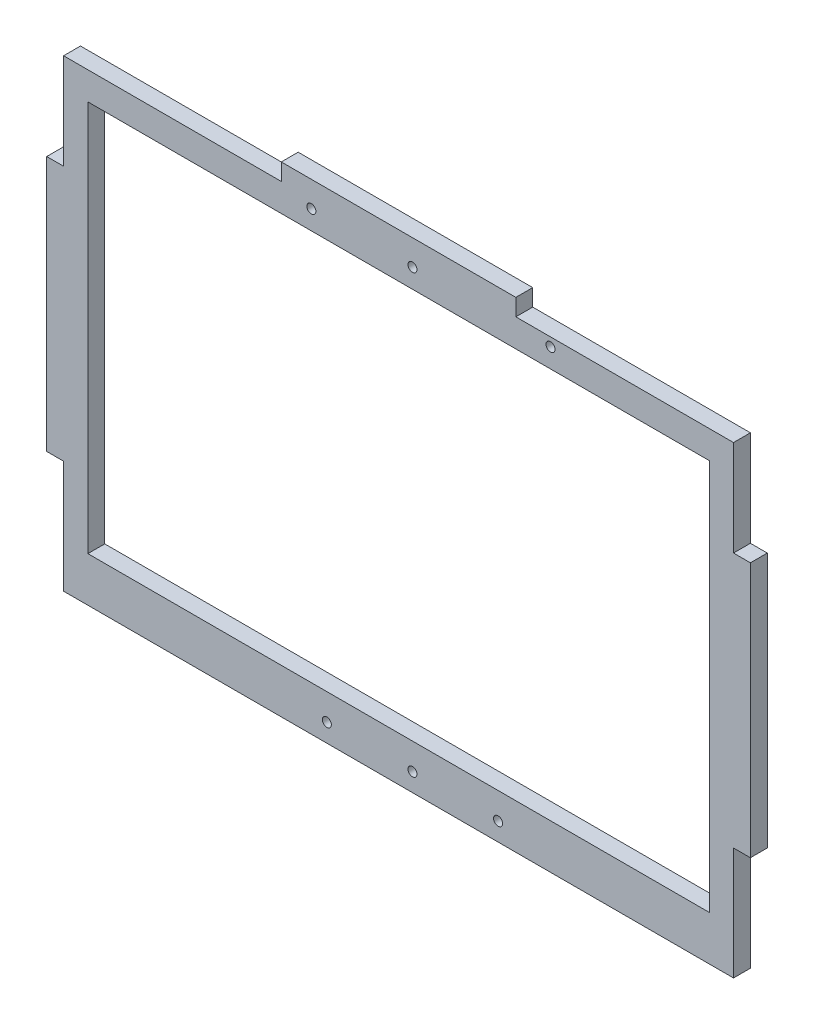
ISO-10303-21;
HEADER;
FILE_DESCRIPTION(('STEP AP214'),'2;1');
FILE_NAME('part.step','',(''),(''),'','','');
FILE_SCHEMA(('AUTOMOTIVE_DESIGN { 1 0 10303 214 1 1 1 1 }'));
ENDSEC;
DATA;
#1=APPLICATION_CONTEXT('core data for automotive mechanical design processes');
#2=APPLICATION_PROTOCOL_DEFINITION('international standard','automotive_design',2000,#1);
#3=PRODUCT_CONTEXT('',#1,'mechanical');
#4=PRODUCT('Part','Part','',(#3));
#5=PRODUCT_RELATED_PRODUCT_CATEGORY('part','',(#4));
#6=PRODUCT_DEFINITION_FORMATION('','',#4);
#7=PRODUCT_DEFINITION_CONTEXT('part definition',#1,'design');
#8=PRODUCT_DEFINITION('design','',#6,#7);
#9=PRODUCT_DEFINITION_SHAPE('','',#8);
#10=(LENGTH_UNIT() NAMED_UNIT(*) SI_UNIT(.MILLI.,.METRE.));
#11=(NAMED_UNIT(*) PLANE_ANGLE_UNIT() SI_UNIT($,.RADIAN.));
#12=(NAMED_UNIT(*) SI_UNIT($,.STERADIAN.) SOLID_ANGLE_UNIT());
#13=UNCERTAINTY_MEASURE_WITH_UNIT(LENGTH_MEASURE(1.E-05),#10,'distance_accuracy_value','');
#14=(GEOMETRIC_REPRESENTATION_CONTEXT(3) GLOBAL_UNCERTAINTY_ASSIGNED_CONTEXT((#13)) GLOBAL_UNIT_ASSIGNED_CONTEXT((#10,
#11,#12)) REPRESENTATION_CONTEXT('',''));
#15=CARTESIAN_POINT('',(0.,0.,0.));
#16=DIRECTION('',(0.,0.,1.));
#17=DIRECTION('',(1.,0.,0.));
#18=AXIS2_PLACEMENT_3D('',#15,#16,#17);
#19=CARTESIAN_POINT('',(125.,77.8166592675793,3.));
#20=DIRECTION('',(0.,0.,-1.));
#21=DIRECTION('',(-1.,0.,0.));
#22=AXIS2_PLACEMENT_3D('',#19,#20,#21);
#23=PLANE('',#22);
#24=DIRECTION('',(0.,-1.,0.));
#25=VECTOR('',#24,1.);
#26=CARTESIAN_POINT('',(139.62,93.6916592675793,3.));
#27=LINE('',#26,#25);
#28=CARTESIAN_POINT('',(139.62,232.691659267579,3.));
#29=VERTEX_POINT('',#28);
#30=CARTESIAN_POINT('',(139.62,93.6916592675793,3.));
#31=VERTEX_POINT('',#30);
#32=EDGE_CURVE('E220',#29,#31,#27,.T.);
#33=ORIENTED_EDGE('',*,*,#32,.T.);
#34=DIRECTION('',(1.,0.,0.));
#35=VECTOR('',#34,1.);
#36=CARTESIAN_POINT('',(139.62,93.6916592675793,3.));
#37=LINE('',#36,#35);
#38=CARTESIAN_POINT('',(360.38,93.6916592675793,3.));
#39=VERTEX_POINT('',#38);
#40=EDGE_CURVE('E223',#31,#39,#37,.T.);
#41=ORIENTED_EDGE('',*,*,#40,.T.);
#42=DIRECTION('',(0.,1.,0.));
#43=VECTOR('',#42,1.);
#44=CARTESIAN_POINT('',(360.38,93.6916592675793,3.));
#45=LINE('',#44,#43);
#46=CARTESIAN_POINT('',(360.38,232.691659267579,3.));
#47=VERTEX_POINT('',#46);
#48=EDGE_CURVE('E227',#39,#47,#45,.T.);
#49=ORIENTED_EDGE('',*,*,#48,.T.);
#50=DIRECTION('',(-1.,0.,0.));
#51=VECTOR('',#50,1.);
#52=CARTESIAN_POINT('',(139.62,232.691659267579,3.));
#53=LINE('',#52,#51);
#54=EDGE_CURVE('E230',#47,#29,#53,.T.);
#55=ORIENTED_EDGE('',*,*,#54,.T.);
#56=EDGE_LOOP('',(#33,#41,#49,#55));
#57=FACE_BOUND('',#56,.T.);
#58=DIRECTION('',(0.,1.,0.));
#59=VECTOR('',#58,1.);
#60=CARTESIAN_POINT('',(208.333333333333,248.566659267579,3.));
#61=LINE('',#60,#59);
#62=CARTESIAN_POINT('',(208.333333333333,242.566659267579,3.));
#63=VERTEX_POINT('',#62);
#64=CARTESIAN_POINT('',(208.333333333333,248.566659267579,3.));
#65=VERTEX_POINT('',#64);
#66=EDGE_CURVE('E182',#63,#65,#61,.T.);
#67=ORIENTED_EDGE('',*,*,#66,.T.);
#68=DIRECTION('',(-1.,0.,0.));
#69=VECTOR('',#68,1.);
#70=CARTESIAN_POINT('',(125.,248.566659267579,3.));
#71=LINE('',#70,#69);
#72=CARTESIAN_POINT('',(291.666666666667,248.566659267579,3.));
#73=VERTEX_POINT('',#72);
#74=EDGE_CURVE('E38',#73,#65,#71,.T.);
#75=ORIENTED_EDGE('',*,*,#74,.F.);
#76=DIRECTION('',(0.,-1.,0.));
#77=VECTOR('',#76,1.);
#78=CARTESIAN_POINT('',(291.666666666667,248.566659267579,3.));
#79=LINE('',#78,#77);
#80=CARTESIAN_POINT('',(291.666666666667,242.566659267579,3.));
#81=VERTEX_POINT('',#80);
#82=EDGE_CURVE('E204',#73,#81,#79,.T.);
#83=ORIENTED_EDGE('',*,*,#82,.T.);
#84=DIRECTION('',(1.,0.,0.));
#85=VECTOR('',#84,1.);
#86=CARTESIAN_POINT('',(369.,242.566659267579,3.));
#87=LINE('',#86,#85);
#88=CARTESIAN_POINT('',(369.,242.566659267579,3.));
#89=VERTEX_POINT('',#88);
#90=EDGE_CURVE('E207',#81,#89,#87,.T.);
#91=ORIENTED_EDGE('',*,*,#90,.T.);
#92=DIRECTION('',(0.,-1.,0.));
#93=VECTOR('',#92,1.);
#94=CARTESIAN_POINT('',(369.,248.566659267579,3.));
#95=LINE('',#94,#93);
#96=CARTESIAN_POINT('',(369.,208.566659267579,3.));
#97=VERTEX_POINT('',#96);
#98=EDGE_CURVE('E272',#89,#97,#95,.T.);
#99=ORIENTED_EDGE('',*,*,#98,.T.);
#100=DIRECTION('',(1.,0.,0.));
#101=VECTOR('',#100,1.);
#102=CARTESIAN_POINT('',(375.,208.566659267579,3.));
#103=LINE('',#102,#101);
#104=CARTESIAN_POINT('',(375.,208.566659267579,3.));
#105=VERTEX_POINT('',#104);
#106=EDGE_CURVE('E274',#97,#105,#103,.T.);
#107=ORIENTED_EDGE('',*,*,#106,.T.);
#108=DIRECTION('',(0.,1.,0.));
#109=VECTOR('',#108,1.);
#110=CARTESIAN_POINT('',(375.,77.8166592675793,3.));
#111=LINE('',#110,#109);
#112=CARTESIAN_POINT('',(375.,117.816659267579,3.));
#113=VERTEX_POINT('',#112);
#114=EDGE_CURVE('E328',#113,#105,#111,.T.);
#115=ORIENTED_EDGE('',*,*,#114,.F.);
#116=DIRECTION('',(-1.,0.,0.));
#117=VECTOR('',#116,1.);
#118=CARTESIAN_POINT('',(375.,117.816659267579,3.));
#119=LINE('',#118,#117);
#120=CARTESIAN_POINT('',(369.,117.816659267579,3.));
#121=VERTEX_POINT('',#120);
#122=EDGE_CURVE('E287',#113,#121,#119,.T.);
#123=ORIENTED_EDGE('',*,*,#122,.T.);
#124=DIRECTION('',(0.,-1.,0.));
#125=VECTOR('',#124,1.);
#126=CARTESIAN_POINT('',(369.,77.8166592675793,3.));
#127=LINE('',#126,#125);
#128=CARTESIAN_POINT('',(369.,77.8166592675793,3.));
#129=VERTEX_POINT('',#128);
#130=EDGE_CURVE('E290',#121,#129,#127,.T.);
#131=ORIENTED_EDGE('',*,*,#130,.T.);
#132=DIRECTION('',(1.,0.,0.));
#133=VECTOR('',#132,1.);
#134=CARTESIAN_POINT('',(125.,77.8166592675793,3.));
#135=LINE('',#134,#133);
#136=CARTESIAN_POINT('',(131.,77.8166592675793,3.));
#137=VERTEX_POINT('',#136);
#138=EDGE_CURVE('E326',#137,#129,#135,.T.);
#139=ORIENTED_EDGE('',*,*,#138,.F.);
#140=DIRECTION('',(0.,1.,0.));
#141=VECTOR('',#140,1.);
#142=CARTESIAN_POINT('',(131.,77.8166592675793,3.));
#143=LINE('',#142,#141);
#144=CARTESIAN_POINT('',(131.,117.816659267579,3.));
#145=VERTEX_POINT('',#144);
#146=EDGE_CURVE('E252',#137,#145,#143,.T.);
#147=ORIENTED_EDGE('',*,*,#146,.T.);
#148=DIRECTION('',(-1.,0.,0.));
#149=VECTOR('',#148,1.);
#150=CARTESIAN_POINT('',(125.,117.816659267579,3.));
#151=LINE('',#150,#149);
#152=CARTESIAN_POINT('',(125.,117.816659267579,3.));
#153=VERTEX_POINT('',#152);
#154=EDGE_CURVE('E255',#145,#153,#151,.T.);
#155=ORIENTED_EDGE('',*,*,#154,.T.);
#156=DIRECTION('',(0.,-1.,0.));
#157=VECTOR('',#156,1.);
#158=CARTESIAN_POINT('',(125.,77.8166592675793,3.));
#159=LINE('',#158,#157);
#160=CARTESIAN_POINT('',(125.,208.566659267579,3.));
#161=VERTEX_POINT('',#160);
#162=EDGE_CURVE('E314',#161,#153,#159,.T.);
#163=ORIENTED_EDGE('',*,*,#162,.F.);
#164=DIRECTION('',(1.,0.,0.));
#165=VECTOR('',#164,1.);
#166=CARTESIAN_POINT('',(125.,208.566659267579,3.));
#167=LINE('',#166,#165);
#168=CARTESIAN_POINT('',(131.,208.566659267579,3.));
#169=VERTEX_POINT('',#168);
#170=EDGE_CURVE('E303',#161,#169,#167,.T.);
#171=ORIENTED_EDGE('',*,*,#170,.T.);
#172=DIRECTION('',(0.,1.,0.));
#173=VECTOR('',#172,1.);
#174=CARTESIAN_POINT('',(131.,248.566659267579,3.));
#175=LINE('',#174,#173);
#176=CARTESIAN_POINT('',(131.,242.566659267579,3.));
#177=VERTEX_POINT('',#176);
#178=EDGE_CURVE('E192',#169,#177,#175,.T.);
#179=ORIENTED_EDGE('',*,*,#178,.T.);
#180=DIRECTION('',(1.,0.,0.));
#181=VECTOR('',#180,1.);
#182=CARTESIAN_POINT('',(131.,242.566659267579,3.));
#183=LINE('',#182,#181);
#184=EDGE_CURVE('E51',#177,#63,#183,.T.);
#185=ORIENTED_EDGE('',*,*,#184,.T.);
#186=EDGE_LOOP('',(#67,#75,#83,#91,#99,#107,#115,#123,#131,#139,#147,#155,#163,#171,#179,#185));
#187=FACE_BOUND('',#186,.T.);
#188=CARTESIAN_POINT('',(285.36,84.2916592675793,3.));
#189=DIRECTION('',(0.,0.,1.));
#190=DIRECTION('',(1.,0.,0.));
#191=AXIS2_PLACEMENT_3D('',#188,#189,#190);
#192=CIRCLE('',#191,1.59999999999999);
#193=CARTESIAN_POINT('',(286.96,84.2916592675793,3.));
#194=VERTEX_POINT('',#193);
#195=EDGE_CURVE('E197',#194,#194,#192,.T.);
#196=ORIENTED_EDGE('',*,*,#195,.T.);
#197=EDGE_LOOP('',(#196));
#198=FACE_BOUND('',#197,.T.);
#199=CARTESIAN_POINT('',(224.52,84.2916592675793,3.));
#200=DIRECTION('',(0.,0.,1.));
#201=DIRECTION('',(1.,0.,0.));
#202=AXIS2_PLACEMENT_3D('',#199,#200,#201);
#203=CIRCLE('',#202,1.59999999999999);
#204=CARTESIAN_POINT('',(226.12,84.2916592675793,3.));
#205=VERTEX_POINT('',#204);
#206=EDGE_CURVE('E637',#205,#205,#203,.T.);
#207=ORIENTED_EDGE('',*,*,#206,.T.);
#208=EDGE_LOOP('',(#207));
#209=FACE_BOUND('',#208,.T.);
#210=CARTESIAN_POINT('',(303.98,239.491659267579,3.));
#211=DIRECTION('',(0.,0.,1.));
#212=DIRECTION('',(1.,0.,0.));
#213=AXIS2_PLACEMENT_3D('',#210,#211,#212);
#214=CIRCLE('',#213,1.59999999999999);
#215=CARTESIAN_POINT('',(305.58,239.491659267579,3.));
#216=VERTEX_POINT('',#215);
#217=EDGE_CURVE('E644',#216,#216,#214,.T.);
#218=ORIENTED_EDGE('',*,*,#217,.T.);
#219=EDGE_LOOP('',(#218));
#220=FACE_BOUND('',#219,.T.);
#221=CARTESIAN_POINT('',(219.02,239.491659267579,3.));
#222=DIRECTION('',(0.,0.,1.));
#223=DIRECTION('',(1.,0.,0.));
#224=AXIS2_PLACEMENT_3D('',#221,#222,#223);
#225=CIRCLE('',#224,1.59999999999999);
#226=CARTESIAN_POINT('',(220.62,239.491659267579,3.));
#227=VERTEX_POINT('',#226);
#228=EDGE_CURVE('E650',#227,#227,#225,.T.);
#229=ORIENTED_EDGE('',*,*,#228,.T.);
#230=EDGE_LOOP('',(#229));
#231=FACE_BOUND('',#230,.T.);
#232=CARTESIAN_POINT('',(254.94,239.491659267579,3.));
#233=DIRECTION('',(0.,0.,1.));
#234=DIRECTION('',(1.,0.,0.));
#235=AXIS2_PLACEMENT_3D('',#232,#233,#234);
#236=CIRCLE('',#235,1.59999999999999);
#237=CARTESIAN_POINT('',(256.54,239.491659267579,3.));
#238=VERTEX_POINT('',#237);
#239=EDGE_CURVE('E656',#238,#238,#236,.T.);
#240=ORIENTED_EDGE('',*,*,#239,.T.);
#241=EDGE_LOOP('',(#240));
#242=FACE_BOUND('',#241,.T.);
#243=CARTESIAN_POINT('',(254.94,84.2966592675793,3.));
#244=DIRECTION('',(0.,0.,1.));
#245=DIRECTION('',(1.,0.,0.));
#246=AXIS2_PLACEMENT_3D('',#243,#244,#245);
#247=CIRCLE('',#246,1.59999999999999);
#248=CARTESIAN_POINT('',(256.54,84.2966592675793,3.));
#249=VERTEX_POINT('',#248);
#250=EDGE_CURVE('E662',#249,#249,#247,.T.);
#251=ORIENTED_EDGE('',*,*,#250,.T.);
#252=EDGE_LOOP('',(#251));
#253=FACE_BOUND('',#252,.T.);
#254=ADVANCED_FACE('F34',(#57,#187,#198,#209,#220,#231,#242,#253),#23,.T.);
#255=CARTESIAN_POINT('',(125.,77.8166592675793,9.));
#256=DIRECTION('',(1.,0.,0.));
#257=DIRECTION('',(0.,0.,-1.));
#258=AXIS2_PLACEMENT_3D('',#255,#256,#257);
#259=PLANE('',#258);
#260=ORIENTED_EDGE('',*,*,#162,.T.);
#261=DIRECTION('',(0.,0.,1.));
#262=VECTOR('',#261,1.);
#263=CARTESIAN_POINT('',(125.,117.816659267579,3.));
#264=LINE('',#263,#262);
#265=CARTESIAN_POINT('',(125.,117.816659267579,9.));
#266=VERTEX_POINT('',#265);
#267=EDGE_CURVE('E265',#153,#266,#264,.T.);
#268=ORIENTED_EDGE('',*,*,#267,.T.);
#269=DIRECTION('',(0.,-1.,0.));
#270=VECTOR('',#269,1.);
#271=CARTESIAN_POINT('',(125.,77.8166592675793,9.));
#272=LINE('',#271,#270);
#273=CARTESIAN_POINT('',(125.,208.566659267579,9.));
#274=VERTEX_POINT('',#273);
#275=EDGE_CURVE('E316',#274,#266,#272,.T.);
#276=ORIENTED_EDGE('',*,*,#275,.F.);
#277=DIRECTION('',(0.,0.,1.));
#278=VECTOR('',#277,1.);
#279=CARTESIAN_POINT('',(125.,208.566659267579,3.));
#280=LINE('',#279,#278);
#281=EDGE_CURVE('E307',#161,#274,#280,.T.);
#282=ORIENTED_EDGE('',*,*,#281,.F.);
#283=EDGE_LOOP('',(#260,#268,#276,#282));
#284=FACE_BOUND('',#283,.T.);
#285=ADVANCED_FACE('F36',(#284),#259,.F.);
#286=CARTESIAN_POINT('',(125.,77.8166592675793,9.));
#287=DIRECTION('',(0.,1.,0.));
#288=DIRECTION('',(0.,0.,1.));
#289=AXIS2_PLACEMENT_3D('',#286,#287,#288);
#290=PLANE('',#289);
#291=DIRECTION('',(1.,0.,0.));
#292=VECTOR('',#291,1.);
#293=CARTESIAN_POINT('',(125.,77.8166592675793,9.));
#294=LINE('',#293,#292);
#295=CARTESIAN_POINT('',(131.,77.8166592675793,9.));
#296=VERTEX_POINT('',#295);
#297=CARTESIAN_POINT('',(369.,77.8166592675793,9.));
#298=VERTEX_POINT('',#297);
#299=EDGE_CURVE('E319',#296,#298,#294,.T.);
#300=ORIENTED_EDGE('',*,*,#299,.F.);
#301=DIRECTION('',(0.,0.,1.));
#302=VECTOR('',#301,1.);
#303=CARTESIAN_POINT('',(131.,77.8166592675793,3.));
#304=LINE('',#303,#302);
#305=EDGE_CURVE('E259',#137,#296,#304,.T.);
#306=ORIENTED_EDGE('',*,*,#305,.F.);
#307=ORIENTED_EDGE('',*,*,#138,.T.);
#308=DIRECTION('',(0.,0.,1.));
#309=VECTOR('',#308,1.);
#310=CARTESIAN_POINT('',(369.,77.8166592675793,3.));
#311=LINE('',#310,#309);
#312=EDGE_CURVE('E281',#129,#298,#311,.T.);
#313=ORIENTED_EDGE('',*,*,#312,.T.);
#314=EDGE_LOOP('',(#300,#306,#307,#313));
#315=FACE_BOUND('',#314,.T.);
#316=ADVANCED_FACE('F365',(#315),#290,.F.);
#317=CARTESIAN_POINT('',(375.,77.8166592675793,9.));
#318=DIRECTION('',(-1.,0.,0.));
#319=DIRECTION('',(0.,0.,1.));
#320=AXIS2_PLACEMENT_3D('',#317,#318,#319);
#321=PLANE('',#320);
#322=ORIENTED_EDGE('',*,*,#114,.T.);
#323=DIRECTION('',(0.,0.,1.));
#324=VECTOR('',#323,1.);
#325=CARTESIAN_POINT('',(375.,208.566659267579,3.));
#326=LINE('',#325,#324);
#327=CARTESIAN_POINT('',(375.,208.566659267579,9.));
#328=VERTEX_POINT('',#327);
#329=EDGE_CURVE('E263',#105,#328,#326,.T.);
#330=ORIENTED_EDGE('',*,*,#329,.T.);
#331=DIRECTION('',(0.,1.,0.));
#332=VECTOR('',#331,1.);
#333=CARTESIAN_POINT('',(375.,77.8166592675793,9.));
#334=LINE('',#333,#332);
#335=CARTESIAN_POINT('',(375.,117.816659267579,9.));
#336=VERTEX_POINT('',#335);
#337=EDGE_CURVE('E43',#336,#328,#334,.T.);
#338=ORIENTED_EDGE('',*,*,#337,.F.);
#339=DIRECTION('',(0.,0.,1.));
#340=VECTOR('',#339,1.);
#341=CARTESIAN_POINT('',(375.,117.816659267579,3.));
#342=LINE('',#341,#340);
#343=EDGE_CURVE('E294',#113,#336,#342,.T.);
#344=ORIENTED_EDGE('',*,*,#343,.F.);
#345=EDGE_LOOP('',(#322,#330,#338,#344));
#346=FACE_BOUND('',#345,.T.);
#347=ADVANCED_FACE('F355',(#346),#321,.F.);
#348=CARTESIAN_POINT('',(125.,248.566659267579,9.));
#349=DIRECTION('',(0.,-1.,0.));
#350=DIRECTION('',(0.,0.,-1.));
#351=AXIS2_PLACEMENT_3D('',#348,#349,#350);
#352=PLANE('',#351);
#353=ORIENTED_EDGE('',*,*,#74,.T.);
#354=DIRECTION('',(0.,0.,1.));
#355=VECTOR('',#354,1.);
#356=CARTESIAN_POINT('',(208.333333333333,248.566659267579,3.));
#357=LINE('',#356,#355);
#358=CARTESIAN_POINT('',(208.333333333333,248.566659267579,9.));
#359=VERTEX_POINT('',#358);
#360=EDGE_CURVE('E178',#65,#359,#357,.T.);
#361=ORIENTED_EDGE('',*,*,#360,.T.);
#362=DIRECTION('',(-1.,0.,0.));
#363=VECTOR('',#362,1.);
#364=CARTESIAN_POINT('',(125.,248.566659267579,9.));
#365=LINE('',#364,#363);
#366=CARTESIAN_POINT('',(291.666666666667,248.566659267579,9.));
#367=VERTEX_POINT('',#366);
#368=EDGE_CURVE('E11',#367,#359,#365,.T.);
#369=ORIENTED_EDGE('',*,*,#368,.F.);
#370=DIRECTION('',(0.,0.,1.));
#371=VECTOR('',#370,1.);
#372=CARTESIAN_POINT('',(291.666666666667,248.566659267579,3.));
#373=LINE('',#372,#371);
#374=EDGE_CURVE('E210',#73,#367,#373,.T.);
#375=ORIENTED_EDGE('',*,*,#374,.F.);
#376=EDGE_LOOP('',(#353,#361,#369,#375));
#377=FACE_BOUND('',#376,.T.);
#378=ADVANCED_FACE('F335',(#377),#352,.F.);
#379=CARTESIAN_POINT('',(125.,77.8166592675793,9.));
#380=DIRECTION('',(0.,0.,-1.));
#381=DIRECTION('',(-1.,0.,0.));
#382=AXIS2_PLACEMENT_3D('',#379,#380,#381);
#383=PLANE('',#382);
#384=CARTESIAN_POINT('',(254.94,84.2966592675793,9.));
#385=DIRECTION('',(0.,0.,1.));
#386=DIRECTION('',(1.,0.,0.));
#387=AXIS2_PLACEMENT_3D('',#384,#385,#386);
#388=CIRCLE('',#387,1.59999999999999);
#389=CARTESIAN_POINT('',(256.54,84.2966592675793,9.));
#390=VERTEX_POINT('',#389);
#391=EDGE_CURVE('E665',#390,#390,#388,.T.);
#392=ORIENTED_EDGE('',*,*,#391,.F.);
#393=EDGE_LOOP('',(#392));
#394=FACE_BOUND('',#393,.T.);
#395=CARTESIAN_POINT('',(254.94,239.491659267579,9.));
#396=DIRECTION('',(0.,0.,1.));
#397=DIRECTION('',(1.,0.,0.));
#398=AXIS2_PLACEMENT_3D('',#395,#396,#397);
#399=CIRCLE('',#398,1.59999999999999);
#400=CARTESIAN_POINT('',(256.54,239.491659267579,9.));
#401=VERTEX_POINT('',#400);
#402=EDGE_CURVE('E659',#401,#401,#399,.T.);
#403=ORIENTED_EDGE('',*,*,#402,.F.);
#404=EDGE_LOOP('',(#403));
#405=FACE_BOUND('',#404,.T.);
#406=CARTESIAN_POINT('',(219.02,239.491659267579,9.));
#407=DIRECTION('',(0.,0.,1.));
#408=DIRECTION('',(1.,0.,0.));
#409=AXIS2_PLACEMENT_3D('',#406,#407,#408);
#410=CIRCLE('',#409,1.59999999999999);
#411=CARTESIAN_POINT('',(220.62,239.491659267579,9.));
#412=VERTEX_POINT('',#411);
#413=EDGE_CURVE('E653',#412,#412,#410,.T.);
#414=ORIENTED_EDGE('',*,*,#413,.F.);
#415=EDGE_LOOP('',(#414));
#416=FACE_BOUND('',#415,.T.);
#417=CARTESIAN_POINT('',(303.98,239.491659267579,9.));
#418=DIRECTION('',(0.,0.,1.));
#419=DIRECTION('',(1.,0.,0.));
#420=AXIS2_PLACEMENT_3D('',#417,#418,#419);
#421=CIRCLE('',#420,1.59999999999999);
#422=CARTESIAN_POINT('',(305.58,239.491659267579,9.));
#423=VERTEX_POINT('',#422);
#424=EDGE_CURVE('E647',#423,#423,#421,.T.);
#425=ORIENTED_EDGE('',*,*,#424,.F.);
#426=EDGE_LOOP('',(#425));
#427=FACE_BOUND('',#426,.T.);
#428=CARTESIAN_POINT('',(224.52,84.2916592675793,9.));
#429=DIRECTION('',(0.,0.,1.));
#430=DIRECTION('',(1.,0.,0.));
#431=AXIS2_PLACEMENT_3D('',#428,#429,#430);
#432=CIRCLE('',#431,1.59999999999999);
#433=CARTESIAN_POINT('',(226.12,84.2916592675793,9.));
#434=VERTEX_POINT('',#433);
#435=EDGE_CURVE('E639',#434,#434,#432,.T.);
#436=ORIENTED_EDGE('',*,*,#435,.F.);
#437=EDGE_LOOP('',(#436));
#438=FACE_BOUND('',#437,.T.);
#439=CARTESIAN_POINT('',(285.36,84.2916592675793,9.));
#440=DIRECTION('',(0.,0.,1.));
#441=DIRECTION('',(1.,0.,0.));
#442=AXIS2_PLACEMENT_3D('',#439,#440,#441);
#443=CIRCLE('',#442,1.59999999999999);
#444=CARTESIAN_POINT('',(286.96,84.2916592675793,9.));
#445=VERTEX_POINT('',#444);
#446=EDGE_CURVE('E635',#445,#445,#443,.T.);
#447=ORIENTED_EDGE('',*,*,#446,.F.);
#448=EDGE_LOOP('',(#447));
#449=FACE_BOUND('',#448,.T.);
#450=DIRECTION('',(1.,0.,0.));
#451=VECTOR('',#450,1.);
#452=CARTESIAN_POINT('',(139.62,93.6916592675793,9.));
#453=LINE('',#452,#451);
#454=CARTESIAN_POINT('',(139.62,93.6916592675793,9.));
#455=VERTEX_POINT('',#454);
#456=CARTESIAN_POINT('',(360.38,93.6916592675793,9.));
#457=VERTEX_POINT('',#456);
#458=EDGE_CURVE('E235',#455,#457,#453,.T.);
#459=ORIENTED_EDGE('',*,*,#458,.F.);
#460=DIRECTION('',(0.,-1.,0.));
#461=VECTOR('',#460,1.);
#462=CARTESIAN_POINT('',(139.62,93.6916592675793,9.));
#463=LINE('',#462,#461);
#464=CARTESIAN_POINT('',(139.62,232.691659267579,9.));
#465=VERTEX_POINT('',#464);
#466=EDGE_CURVE('E216',#465,#455,#463,.T.);
#467=ORIENTED_EDGE('',*,*,#466,.F.);
#468=DIRECTION('',(-1.,0.,0.));
#469=VECTOR('',#468,1.);
#470=CARTESIAN_POINT('',(139.62,232.691659267579,9.));
#471=LINE('',#470,#469);
#472=CARTESIAN_POINT('',(360.38,232.691659267579,9.));
#473=VERTEX_POINT('',#472);
#474=EDGE_CURVE('E224',#473,#465,#471,.T.);
#475=ORIENTED_EDGE('',*,*,#474,.F.);
#476=DIRECTION('',(0.,1.,0.));
#477=VECTOR('',#476,1.);
#478=CARTESIAN_POINT('',(360.38,93.6916592675793,9.));
#479=LINE('',#478,#477);
#480=EDGE_CURVE('E238',#457,#473,#479,.T.);
#481=ORIENTED_EDGE('',*,*,#480,.F.);
#482=EDGE_LOOP('',(#459,#467,#475,#481));
#483=FACE_BOUND('',#482,.T.);
#484=ORIENTED_EDGE('',*,*,#368,.T.);
#485=DIRECTION('',(0.,1.,0.));
#486=VECTOR('',#485,1.);
#487=CARTESIAN_POINT('',(208.333333333333,248.566659267579,9.));
#488=LINE('',#487,#486);
#489=CARTESIAN_POINT('',(208.333333333333,242.566659267579,9.));
#490=VERTEX_POINT('',#489);
#491=EDGE_CURVE('E193',#490,#359,#488,.T.);
#492=ORIENTED_EDGE('',*,*,#491,.F.);
#493=DIRECTION('',(1.,0.,0.));
#494=VECTOR('',#493,1.);
#495=CARTESIAN_POINT('',(131.,242.566659267579,9.));
#496=LINE('',#495,#494);
#497=CARTESIAN_POINT('',(131.,242.566659267579,9.));
#498=VERTEX_POINT('',#497);
#499=EDGE_CURVE('E175',#498,#490,#496,.T.);
#500=ORIENTED_EDGE('',*,*,#499,.F.);
#501=DIRECTION('',(0.,1.,0.));
#502=VECTOR('',#501,1.);
#503=CARTESIAN_POINT('',(131.,248.566659267579,9.));
#504=LINE('',#503,#502);
#505=CARTESIAN_POINT('',(131.,208.566659267579,9.));
#506=VERTEX_POINT('',#505);
#507=EDGE_CURVE('E305',#506,#498,#504,.T.);
#508=ORIENTED_EDGE('',*,*,#507,.F.);
#509=DIRECTION('',(1.,0.,0.));
#510=VECTOR('',#509,1.);
#511=CARTESIAN_POINT('',(125.,208.566659267579,9.));
#512=LINE('',#511,#510);
#513=EDGE_CURVE('E268',#274,#506,#512,.T.);
#514=ORIENTED_EDGE('',*,*,#513,.F.);
#515=ORIENTED_EDGE('',*,*,#275,.T.);
#516=DIRECTION('',(-1.,0.,0.));
#517=VECTOR('',#516,1.);
#518=CARTESIAN_POINT('',(125.,117.816659267579,9.));
#519=LINE('',#518,#517);
#520=CARTESIAN_POINT('',(131.,117.816659267579,9.));
#521=VERTEX_POINT('',#520);
#522=EDGE_CURVE('E256',#521,#266,#519,.T.);
#523=ORIENTED_EDGE('',*,*,#522,.F.);
#524=DIRECTION('',(0.,1.,0.));
#525=VECTOR('',#524,1.);
#526=CARTESIAN_POINT('',(131.,77.8166592675793,9.));
#527=LINE('',#526,#525);
#528=EDGE_CURVE('E260',#296,#521,#527,.T.);
#529=ORIENTED_EDGE('',*,*,#528,.F.);
#530=ORIENTED_EDGE('',*,*,#299,.T.);
#531=DIRECTION('',(0.,-1.,0.));
#532=VECTOR('',#531,1.);
#533=CARTESIAN_POINT('',(369.,77.8166592675793,9.));
#534=LINE('',#533,#532);
#535=CARTESIAN_POINT('',(369.,117.816659267579,9.));
#536=VERTEX_POINT('',#535);
#537=EDGE_CURVE('E291',#536,#298,#534,.T.);
#538=ORIENTED_EDGE('',*,*,#537,.F.);
#539=DIRECTION('',(-1.,0.,0.));
#540=VECTOR('',#539,1.);
#541=CARTESIAN_POINT('',(375.,117.816659267579,9.));
#542=LINE('',#541,#540);
#543=EDGE_CURVE('E245',#336,#536,#542,.T.);
#544=ORIENTED_EDGE('',*,*,#543,.F.);
#545=ORIENTED_EDGE('',*,*,#337,.T.);
#546=DIRECTION('',(1.,0.,0.));
#547=VECTOR('',#546,1.);
#548=CARTESIAN_POINT('',(375.,208.566659267579,9.));
#549=LINE('',#548,#547);
#550=CARTESIAN_POINT('',(369.,208.566659267579,9.));
#551=VERTEX_POINT('',#550);
#552=EDGE_CURVE('E275',#551,#328,#549,.T.);
#553=ORIENTED_EDGE('',*,*,#552,.F.);
#554=DIRECTION('',(0.,-1.,0.));
#555=VECTOR('',#554,1.);
#556=CARTESIAN_POINT('',(369.,248.566659267579,9.));
#557=LINE('',#556,#555);
#558=CARTESIAN_POINT('',(369.,242.566659267579,9.));
#559=VERTEX_POINT('',#558);
#560=EDGE_CURVE('E279',#559,#551,#557,.T.);
#561=ORIENTED_EDGE('',*,*,#560,.F.);
#562=DIRECTION('',(1.,0.,0.));
#563=VECTOR('',#562,1.);
#564=CARTESIAN_POINT('',(369.,242.566659267579,9.));
#565=LINE('',#564,#563);
#566=CARTESIAN_POINT('',(291.666666666667,242.566659267579,9.));
#567=VERTEX_POINT('',#566);
#568=EDGE_CURVE('E59',#567,#559,#565,.T.);
#569=ORIENTED_EDGE('',*,*,#568,.F.);
#570=DIRECTION('',(0.,-1.,0.));
#571=VECTOR('',#570,1.);
#572=CARTESIAN_POINT('',(291.666666666667,248.566659267579,9.));
#573=LINE('',#572,#571);
#574=EDGE_CURVE('E201',#367,#567,#573,.T.);
#575=ORIENTED_EDGE('',*,*,#574,.F.);
#576=EDGE_LOOP('',(#484,#492,#500,#508,#514,#515,#523,#529,#530,#538,#544,#545,#553,#561,#569,#575));
#577=FACE_BOUND('',#576,.T.);
#578=ADVANCED_FACE('F349',(#394,#405,#416,#427,#438,#449,#483,#577),#383,.F.);
#579=CARTESIAN_POINT('',(131.,248.566659267579,3.));
#580=DIRECTION('',(1.,0.,0.));
#581=DIRECTION('',(0.,1.,0.));
#582=AXIS2_PLACEMENT_3D('',#579,#580,#581);
#583=PLANE('',#582);
#584=ORIENTED_EDGE('',*,*,#507,.T.);
#585=DIRECTION('',(0.,0.,1.));
#586=VECTOR('',#585,1.);
#587=CARTESIAN_POINT('',(131.,242.566659267579,3.));
#588=LINE('',#587,#586);
#589=EDGE_CURVE('E179',#177,#498,#588,.T.);
#590=ORIENTED_EDGE('',*,*,#589,.F.);
#591=ORIENTED_EDGE('',*,*,#178,.F.);
#592=DIRECTION('',(0.,0.,1.));
#593=VECTOR('',#592,1.);
#594=CARTESIAN_POINT('',(131.,208.566659267579,3.));
#595=LINE('',#594,#593);
#596=EDGE_CURVE('E312',#169,#506,#595,.T.);
#597=ORIENTED_EDGE('',*,*,#596,.T.);
#598=EDGE_LOOP('',(#584,#590,#591,#597));
#599=FACE_BOUND('',#598,.T.);
#600=ADVANCED_FACE('F383',(#599),#583,.F.);
#601=CARTESIAN_POINT('',(125.,208.566659267579,3.));
#602=DIRECTION('',(0.,-1.,0.));
#603=DIRECTION('',(0.,0.,-1.));
#604=AXIS2_PLACEMENT_3D('',#601,#602,#603);
#605=PLANE('',#604);
#606=ORIENTED_EDGE('',*,*,#513,.T.);
#607=ORIENTED_EDGE('',*,*,#596,.F.);
#608=ORIENTED_EDGE('',*,*,#170,.F.);
#609=ORIENTED_EDGE('',*,*,#281,.T.);
#610=EDGE_LOOP('',(#606,#607,#608,#609));
#611=FACE_BOUND('',#610,.T.);
#612=ADVANCED_FACE('F379',(#611),#605,.F.);
#613=CARTESIAN_POINT('',(369.,77.8166592675793,3.));
#614=DIRECTION('',(-1.,0.,0.));
#615=DIRECTION('',(0.,0.,1.));
#616=AXIS2_PLACEMENT_3D('',#613,#614,#615);
#617=PLANE('',#616);
#618=ORIENTED_EDGE('',*,*,#537,.T.);
#619=ORIENTED_EDGE('',*,*,#312,.F.);
#620=ORIENTED_EDGE('',*,*,#130,.F.);
#621=DIRECTION('',(0.,0.,1.));
#622=VECTOR('',#621,1.);
#623=CARTESIAN_POINT('',(369.,117.816659267579,3.));
#624=LINE('',#623,#622);
#625=EDGE_CURVE('E300',#121,#536,#624,.T.);
#626=ORIENTED_EDGE('',*,*,#625,.T.);
#627=EDGE_LOOP('',(#618,#619,#620,#626));
#628=FACE_BOUND('',#627,.T.);
#629=ADVANCED_FACE('F362',(#628),#617,.F.);
#630=CARTESIAN_POINT('',(375.,117.816659267579,3.));
#631=DIRECTION('',(0.,1.,0.));
#632=DIRECTION('',(0.,0.,1.));
#633=AXIS2_PLACEMENT_3D('',#630,#631,#632);
#634=PLANE('',#633);
#635=ORIENTED_EDGE('',*,*,#543,.T.);
#636=ORIENTED_EDGE('',*,*,#625,.F.);
#637=ORIENTED_EDGE('',*,*,#122,.F.);
#638=ORIENTED_EDGE('',*,*,#343,.T.);
#639=EDGE_LOOP('',(#635,#636,#637,#638));
#640=FACE_BOUND('',#639,.T.);
#641=ADVANCED_FACE('F359',(#640),#634,.F.);
#642=CARTESIAN_POINT('',(375.,208.566659267579,3.));
#643=DIRECTION('',(0.,-1.,0.));
#644=DIRECTION('',(0.,0.,-1.));
#645=AXIS2_PLACEMENT_3D('',#642,#643,#644);
#646=PLANE('',#645);
#647=ORIENTED_EDGE('',*,*,#552,.T.);
#648=ORIENTED_EDGE('',*,*,#329,.F.);
#649=ORIENTED_EDGE('',*,*,#106,.F.);
#650=DIRECTION('',(0.,0.,1.));
#651=VECTOR('',#650,1.);
#652=CARTESIAN_POINT('',(369.,208.566659267579,3.));
#653=LINE('',#652,#651);
#654=EDGE_CURVE('E278',#97,#551,#653,.T.);
#655=ORIENTED_EDGE('',*,*,#654,.T.);
#656=EDGE_LOOP('',(#647,#648,#649,#655));
#657=FACE_BOUND('',#656,.T.);
#658=ADVANCED_FACE('F353',(#657),#646,.F.);
#659=CARTESIAN_POINT('',(369.,248.566659267579,3.));
#660=DIRECTION('',(-1.,0.,0.));
#661=DIRECTION('',(0.,0.,1.));
#662=AXIS2_PLACEMENT_3D('',#659,#660,#661);
#663=PLANE('',#662);
#664=ORIENTED_EDGE('',*,*,#98,.F.);
#665=DIRECTION('',(0.,0.,1.));
#666=VECTOR('',#665,1.);
#667=CARTESIAN_POINT('',(369.,242.566659267579,3.));
#668=LINE('',#667,#666);
#669=EDGE_CURVE('E214',#89,#559,#668,.T.);
#670=ORIENTED_EDGE('',*,*,#669,.T.);
#671=ORIENTED_EDGE('',*,*,#560,.T.);
#672=ORIENTED_EDGE('',*,*,#654,.F.);
#673=EDGE_LOOP('',(#664,#670,#671,#672));
#674=FACE_BOUND('',#673,.T.);
#675=ADVANCED_FACE('F345',(#674),#663,.F.);
#676=CARTESIAN_POINT('',(125.,117.816659267579,3.));
#677=DIRECTION('',(0.,1.,0.));
#678=DIRECTION('',(0.,0.,1.));
#679=AXIS2_PLACEMENT_3D('',#676,#677,#678);
#680=PLANE('',#679);
#681=ORIENTED_EDGE('',*,*,#522,.T.);
#682=ORIENTED_EDGE('',*,*,#267,.F.);
#683=ORIENTED_EDGE('',*,*,#154,.F.);
#684=DIRECTION('',(0.,0.,1.));
#685=VECTOR('',#684,1.);
#686=CARTESIAN_POINT('',(131.,117.816659267579,3.));
#687=LINE('',#686,#685);
#688=EDGE_CURVE('E269',#145,#521,#687,.T.);
#689=ORIENTED_EDGE('',*,*,#688,.T.);
#690=EDGE_LOOP('',(#681,#682,#683,#689));
#691=FACE_BOUND('',#690,.T.);
#692=ADVANCED_FACE('F492',(#691),#680,.F.);
#693=CARTESIAN_POINT('',(131.,77.8166592675793,3.));
#694=DIRECTION('',(1.,0.,0.));
#695=DIRECTION('',(0.,0.,-1.));
#696=AXIS2_PLACEMENT_3D('',#693,#694,#695);
#697=PLANE('',#696);
#698=ORIENTED_EDGE('',*,*,#528,.T.);
#699=ORIENTED_EDGE('',*,*,#688,.F.);
#700=ORIENTED_EDGE('',*,*,#146,.F.);
#701=ORIENTED_EDGE('',*,*,#305,.T.);
#702=EDGE_LOOP('',(#698,#699,#700,#701));
#703=FACE_BOUND('',#702,.T.);
#704=ADVANCED_FACE('F371',(#703),#697,.F.);
#705=CARTESIAN_POINT('',(139.62,93.6916592675793,3.));
#706=DIRECTION('',(-1.,0.,0.));
#707=DIRECTION('',(0.,0.,1.));
#708=AXIS2_PLACEMENT_3D('',#705,#706,#707);
#709=PLANE('',#708);
#710=ORIENTED_EDGE('',*,*,#466,.T.);
#711=DIRECTION('',(0.,0.,1.));
#712=VECTOR('',#711,1.);
#713=CARTESIAN_POINT('',(139.62,93.6916592675793,3.));
#714=LINE('',#713,#712);
#715=EDGE_CURVE('E233',#31,#455,#714,.T.);
#716=ORIENTED_EDGE('',*,*,#715,.F.);
#717=ORIENTED_EDGE('',*,*,#32,.F.);
#718=DIRECTION('',(0.,0.,1.));
#719=VECTOR('',#718,1.);
#720=CARTESIAN_POINT('',(139.62,232.691659267579,3.));
#721=LINE('',#720,#719);
#722=EDGE_CURVE('E243',#29,#465,#721,.T.);
#723=ORIENTED_EDGE('',*,*,#722,.T.);
#724=EDGE_LOOP('',(#710,#716,#717,#723));
#725=FACE_BOUND('',#724,.T.);
#726=ADVANCED_FACE('F481',(#725),#709,.F.);
#727=CARTESIAN_POINT('',(139.62,232.691659267579,3.));
#728=DIRECTION('',(0.,1.,0.));
#729=DIRECTION('',(0.,0.,1.));
#730=AXIS2_PLACEMENT_3D('',#727,#728,#729);
#731=PLANE('',#730);
#732=ORIENTED_EDGE('',*,*,#474,.T.);
#733=ORIENTED_EDGE('',*,*,#722,.F.);
#734=ORIENTED_EDGE('',*,*,#54,.F.);
#735=DIRECTION('',(0.,0.,1.));
#736=VECTOR('',#735,1.);
#737=CARTESIAN_POINT('',(360.38,232.691659267579,3.));
#738=LINE('',#737,#736);
#739=EDGE_CURVE('E246',#47,#473,#738,.T.);
#740=ORIENTED_EDGE('',*,*,#739,.T.);
#741=EDGE_LOOP('',(#732,#733,#734,#740));
#742=FACE_BOUND('',#741,.T.);
#743=ADVANCED_FACE('F477',(#742),#731,.F.);
#744=CARTESIAN_POINT('',(360.38,93.6916592675793,3.));
#745=DIRECTION('',(1.,0.,0.));
#746=DIRECTION('',(0.,0.,-1.));
#747=AXIS2_PLACEMENT_3D('',#744,#745,#746);
#748=PLANE('',#747);
#749=ORIENTED_EDGE('',*,*,#480,.T.);
#750=ORIENTED_EDGE('',*,*,#739,.F.);
#751=ORIENTED_EDGE('',*,*,#48,.F.);
#752=DIRECTION('',(0.,0.,1.));
#753=VECTOR('',#752,1.);
#754=CARTESIAN_POINT('',(360.38,93.6916592675793,3.));
#755=LINE('',#754,#753);
#756=EDGE_CURVE('E248',#39,#457,#755,.T.);
#757=ORIENTED_EDGE('',*,*,#756,.T.);
#758=EDGE_LOOP('',(#749,#750,#751,#757));
#759=FACE_BOUND('',#758,.T.);
#760=ADVANCED_FACE('F480',(#759),#748,.F.);
#761=CARTESIAN_POINT('',(139.62,93.6916592675793,3.));
#762=DIRECTION('',(0.,-1.,0.));
#763=DIRECTION('',(0.,0.,-1.));
#764=AXIS2_PLACEMENT_3D('',#761,#762,#763);
#765=PLANE('',#764);
#766=ORIENTED_EDGE('',*,*,#458,.T.);
#767=ORIENTED_EDGE('',*,*,#756,.F.);
#768=ORIENTED_EDGE('',*,*,#40,.F.);
#769=ORIENTED_EDGE('',*,*,#715,.T.);
#770=EDGE_LOOP('',(#766,#767,#768,#769));
#771=FACE_BOUND('',#770,.T.);
#772=ADVANCED_FACE('F474',(#771),#765,.F.);
#773=CARTESIAN_POINT('',(369.,242.566659267579,3.));
#774=DIRECTION('',(0.,-1.,0.));
#775=DIRECTION('',(1.,0.,0.));
#776=AXIS2_PLACEMENT_3D('',#773,#774,#775);
#777=PLANE('',#776);
#778=ORIENTED_EDGE('',*,*,#568,.T.);
#779=ORIENTED_EDGE('',*,*,#669,.F.);
#780=ORIENTED_EDGE('',*,*,#90,.F.);
#781=DIRECTION('',(0.,0.,1.));
#782=VECTOR('',#781,1.);
#783=CARTESIAN_POINT('',(291.666666666667,242.566659267579,3.));
#784=LINE('',#783,#782);
#785=EDGE_CURVE('E217',#81,#567,#784,.T.);
#786=ORIENTED_EDGE('',*,*,#785,.T.);
#787=EDGE_LOOP('',(#778,#779,#780,#786));
#788=FACE_BOUND('',#787,.T.);
#789=ADVANCED_FACE('F342',(#788),#777,.F.);
#790=CARTESIAN_POINT('',(291.666666666667,248.566659267579,3.));
#791=DIRECTION('',(-1.,0.,0.));
#792=DIRECTION('',(0.,0.,1.));
#793=AXIS2_PLACEMENT_3D('',#790,#791,#792);
#794=PLANE('',#793);
#795=ORIENTED_EDGE('',*,*,#574,.T.);
#796=ORIENTED_EDGE('',*,*,#785,.F.);
#797=ORIENTED_EDGE('',*,*,#82,.F.);
#798=ORIENTED_EDGE('',*,*,#374,.T.);
#799=EDGE_LOOP('',(#795,#796,#797,#798));
#800=FACE_BOUND('',#799,.T.);
#801=ADVANCED_FACE('F340',(#800),#794,.F.);
#802=CARTESIAN_POINT('',(208.333333333333,248.566659267579,3.));
#803=DIRECTION('',(1.,0.,0.));
#804=DIRECTION('',(0.,1.,0.));
#805=AXIS2_PLACEMENT_3D('',#802,#803,#804);
#806=PLANE('',#805);
#807=ORIENTED_EDGE('',*,*,#491,.T.);
#808=ORIENTED_EDGE('',*,*,#360,.F.);
#809=ORIENTED_EDGE('',*,*,#66,.F.);
#810=DIRECTION('',(0.,0.,1.));
#811=VECTOR('',#810,1.);
#812=CARTESIAN_POINT('',(208.333333333333,242.566659267579,3.));
#813=LINE('',#812,#811);
#814=EDGE_CURVE('E171',#63,#490,#813,.T.);
#815=ORIENTED_EDGE('',*,*,#814,.T.);
#816=EDGE_LOOP('',(#807,#808,#809,#815));
#817=FACE_BOUND('',#816,.T.);
#818=ADVANCED_FACE('F183',(#817),#806,.F.);
#819=CARTESIAN_POINT('',(131.,242.566659267579,3.));
#820=DIRECTION('',(0.,-1.,0.));
#821=DIRECTION('',(0.,0.,-1.));
#822=AXIS2_PLACEMENT_3D('',#819,#820,#821);
#823=PLANE('',#822);
#824=ORIENTED_EDGE('',*,*,#499,.T.);
#825=ORIENTED_EDGE('',*,*,#814,.F.);
#826=ORIENTED_EDGE('',*,*,#184,.F.);
#827=ORIENTED_EDGE('',*,*,#589,.T.);
#828=EDGE_LOOP('',(#824,#825,#826,#827));
#829=FACE_BOUND('',#828,.T.);
#830=ADVANCED_FACE('F173',(#829),#823,.F.);
#831=CARTESIAN_POINT('',(285.36,84.2916592675793,9.));
#832=DIRECTION('',(0.,0.,1.));
#833=DIRECTION('',(1.,0.,0.));
#834=AXIS2_PLACEMENT_3D('',#831,#832,#833);
#835=CYLINDRICAL_SURFACE('',#834,1.59999999999999);
#836=ORIENTED_EDGE('',*,*,#195,.F.);
#837=EDGE_LOOP('',(#836));
#838=FACE_BOUND('',#837,.T.);
#839=ORIENTED_EDGE('',*,*,#446,.T.);
#840=EDGE_LOOP('',(#839));
#841=FACE_BOUND('',#840,.T.);
#842=ADVANCED_FACE('F463',(#838,#841),#835,.F.);
#843=CARTESIAN_POINT('',(224.52,84.2916592675793,9.));
#844=DIRECTION('',(0.,0.,1.));
#845=DIRECTION('',(1.,0.,0.));
#846=AXIS2_PLACEMENT_3D('',#843,#844,#845);
#847=CYLINDRICAL_SURFACE('',#846,1.59999999999999);
#848=ORIENTED_EDGE('',*,*,#206,.F.);
#849=EDGE_LOOP('',(#848));
#850=FACE_BOUND('',#849,.T.);
#851=ORIENTED_EDGE('',*,*,#435,.T.);
#852=EDGE_LOOP('',(#851));
#853=FACE_BOUND('',#852,.T.);
#854=ADVANCED_FACE('F459',(#850,#853),#847,.F.);
#855=CARTESIAN_POINT('',(303.98,239.491659267579,9.));
#856=DIRECTION('',(0.,0.,1.));
#857=DIRECTION('',(1.,0.,0.));
#858=AXIS2_PLACEMENT_3D('',#855,#856,#857);
#859=CYLINDRICAL_SURFACE('',#858,1.59999999999999);
#860=ORIENTED_EDGE('',*,*,#217,.F.);
#861=EDGE_LOOP('',(#860));
#862=FACE_BOUND('',#861,.T.);
#863=ORIENTED_EDGE('',*,*,#424,.T.);
#864=EDGE_LOOP('',(#863));
#865=FACE_BOUND('',#864,.T.);
#866=ADVANCED_FACE('F455',(#862,#865),#859,.F.);
#867=CARTESIAN_POINT('',(219.02,239.491659267579,9.));
#868=DIRECTION('',(0.,0.,1.));
#869=DIRECTION('',(1.,0.,0.));
#870=AXIS2_PLACEMENT_3D('',#867,#868,#869);
#871=CYLINDRICAL_SURFACE('',#870,1.59999999999999);
#872=ORIENTED_EDGE('',*,*,#228,.F.);
#873=EDGE_LOOP('',(#872));
#874=FACE_BOUND('',#873,.T.);
#875=ORIENTED_EDGE('',*,*,#413,.T.);
#876=EDGE_LOOP('',(#875));
#877=FACE_BOUND('',#876,.T.);
#878=ADVANCED_FACE('F436',(#874,#877),#871,.F.);
#879=CARTESIAN_POINT('',(254.94,239.491659267579,9.));
#880=DIRECTION('',(0.,0.,1.));
#881=DIRECTION('',(1.,0.,0.));
#882=AXIS2_PLACEMENT_3D('',#879,#880,#881);
#883=CYLINDRICAL_SURFACE('',#882,1.59999999999999);
#884=ORIENTED_EDGE('',*,*,#239,.F.);
#885=EDGE_LOOP('',(#884));
#886=FACE_BOUND('',#885,.T.);
#887=ORIENTED_EDGE('',*,*,#402,.T.);
#888=EDGE_LOOP('',(#887));
#889=FACE_BOUND('',#888,.T.);
#890=ADVANCED_FACE('F430',(#886,#889),#883,.F.);
#891=CARTESIAN_POINT('',(254.94,84.2966592675793,9.));
#892=DIRECTION('',(0.,0.,1.));
#893=DIRECTION('',(1.,0.,0.));
#894=AXIS2_PLACEMENT_3D('',#891,#892,#893);
#895=CYLINDRICAL_SURFACE('',#894,1.59999999999999);
#896=ORIENTED_EDGE('',*,*,#250,.F.);
#897=EDGE_LOOP('',(#896));
#898=FACE_BOUND('',#897,.T.);
#899=ORIENTED_EDGE('',*,*,#391,.T.);
#900=EDGE_LOOP('',(#899));
#901=FACE_BOUND('',#900,.T.);
#902=ADVANCED_FACE('F435',(#898,#901),#895,.F.);
#903=CLOSED_SHELL('',(#254,#285,#316,#347,#378,#578,#600,#612,#629,#641,#658,#675,#692,#704,
#726,#743,#760,#772,#789,#801,#818,#830,#842,#854,#866,#878,#890,#902));
#904=MANIFOLD_SOLID_BREP('B2',#903);
#905=ADVANCED_BREP_SHAPE_REPRESENTATION('',(#18,#904),#14);
#906=SHAPE_DEFINITION_REPRESENTATION(#9,#905);
ENDSEC;
END-ISO-10303-21;
